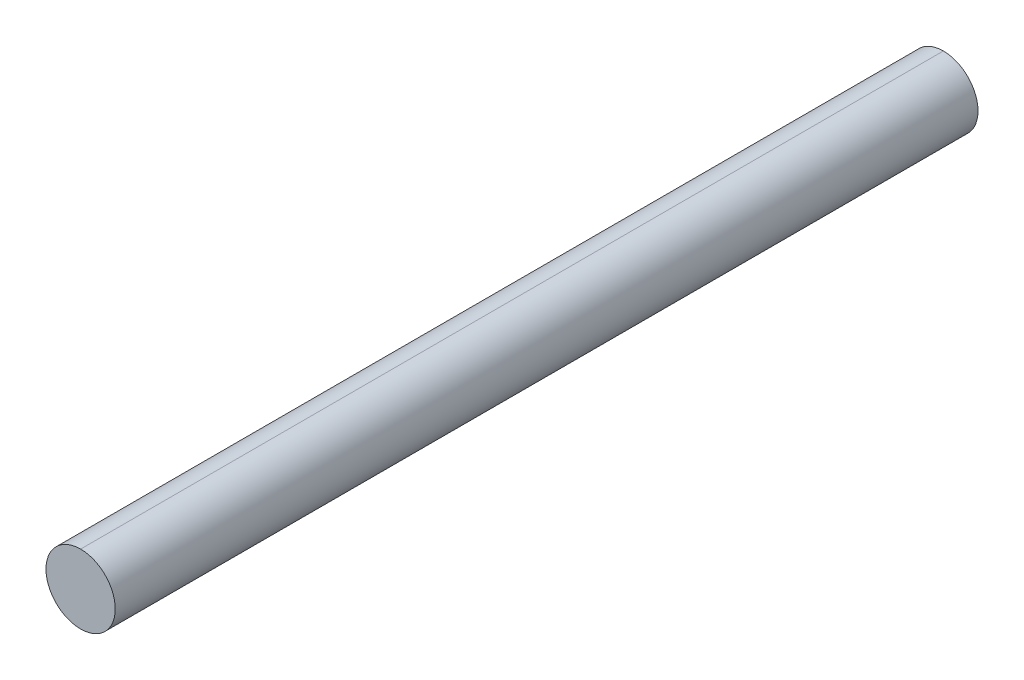
ISO-10303-21;
HEADER;
FILE_DESCRIPTION(('STEP AP214'),'2;1');
FILE_NAME('part.step','',(''),(''),'','','');
FILE_SCHEMA(('AUTOMOTIVE_DESIGN { 1 0 10303 214 1 1 1 1 }'));
ENDSEC;
DATA;
#1=APPLICATION_CONTEXT('core data for automotive mechanical design processes');
#2=APPLICATION_PROTOCOL_DEFINITION('international standard','automotive_design',2000,#1);
#3=PRODUCT_CONTEXT('',#1,'mechanical');
#4=PRODUCT('Part','Part','',(#3));
#5=PRODUCT_RELATED_PRODUCT_CATEGORY('part','',(#4));
#6=PRODUCT_DEFINITION_FORMATION('','',#4);
#7=PRODUCT_DEFINITION_CONTEXT('part definition',#1,'design');
#8=PRODUCT_DEFINITION('design','',#6,#7);
#9=PRODUCT_DEFINITION_SHAPE('','',#8);
#10=(LENGTH_UNIT() NAMED_UNIT(*) SI_UNIT(.MILLI.,.METRE.));
#11=(NAMED_UNIT(*) PLANE_ANGLE_UNIT() SI_UNIT($,.RADIAN.));
#12=(NAMED_UNIT(*) SI_UNIT($,.STERADIAN.) SOLID_ANGLE_UNIT());
#13=UNCERTAINTY_MEASURE_WITH_UNIT(LENGTH_MEASURE(1.E-05),#10,'distance_accuracy_value','');
#14=(GEOMETRIC_REPRESENTATION_CONTEXT(3) GLOBAL_UNCERTAINTY_ASSIGNED_CONTEXT((#13)) GLOBAL_UNIT_ASSIGNED_CONTEXT((#10,
#11,#12)) REPRESENTATION_CONTEXT('',''));
#15=CARTESIAN_POINT('',(0.,0.,0.));
#16=DIRECTION('',(0.,0.,1.));
#17=DIRECTION('',(1.,0.,0.));
#18=AXIS2_PLACEMENT_3D('',#15,#16,#17);
#19=CARTESIAN_POINT('',(0.,0.,304.));
#20=DIRECTION('',(0.,0.,-1.));
#21=DIRECTION('',(-1.,0.,0.));
#22=AXIS2_PLACEMENT_3D('',#19,#20,#21);
#23=CYLINDRICAL_SURFACE('',#22,12.2);
#24=DIRECTION('',(0.,0.,-1.));
#25=VECTOR('',#24,1.);
#26=CARTESIAN_POINT('',(0.,-12.2,304.));
#27=LINE('',#26,#25);
#28=CARTESIAN_POINT('',(0.,-12.2,304.));
#29=VERTEX_POINT('',#28);
#30=CARTESIAN_POINT('',(0.,-12.2,0.));
#31=VERTEX_POINT('',#30);
#32=EDGE_CURVE('E11',#29,#31,#27,.T.);
#33=ORIENTED_EDGE('',*,*,#32,.F.);
#34=CARTESIAN_POINT('',(0.,0.,304.));
#35=DIRECTION('',(0.,0.,1.));
#36=DIRECTION('',(1.,0.,0.));
#37=AXIS2_PLACEMENT_3D('',#34,#35,#36);
#38=CIRCLE('',#37,12.2);
#39=CARTESIAN_POINT('',(0.,12.2,304.));
#40=VERTEX_POINT('',#39);
#41=EDGE_CURVE('E73',#40,#29,#38,.T.);
#42=ORIENTED_EDGE('',*,*,#41,.F.);
#43=DIRECTION('',(0.,0.,-1.));
#44=VECTOR('',#43,1.);
#45=CARTESIAN_POINT('',(0.,12.2,304.));
#46=LINE('',#45,#44);
#47=CARTESIAN_POINT('',(0.,12.2,0.));
#48=VERTEX_POINT('',#47);
#49=EDGE_CURVE('E51',#48,#40,#46,.F.);
#50=ORIENTED_EDGE('',*,*,#49,.F.);
#51=CARTESIAN_POINT('',(0.,0.,0.));
#52=DIRECTION('',(0.,0.,1.));
#53=DIRECTION('',(1.,0.,0.));
#54=AXIS2_PLACEMENT_3D('',#51,#52,#53);
#55=CIRCLE('',#54,12.2);
#56=EDGE_CURVE('E76',#48,#31,#55,.T.);
#57=ORIENTED_EDGE('',*,*,#56,.T.);
#58=EDGE_LOOP('',(#33,#42,#50,#57));
#59=FACE_BOUND('',#58,.T.);
#60=ADVANCED_FACE('F42',(#59),#23,.T.);
#61=EDGE_CURVE('E68',#29,#40,#38,.T.);
#62=ORIENTED_EDGE('',*,*,#61,.F.);
#63=ORIENTED_EDGE('',*,*,#32,.T.);
#64=EDGE_CURVE('E70',#31,#48,#55,.T.);
#65=ORIENTED_EDGE('',*,*,#64,.T.);
#66=ORIENTED_EDGE('',*,*,#49,.T.);
#67=EDGE_LOOP('',(#62,#63,#65,#66));
#68=FACE_BOUND('',#67,.T.);
#69=ADVANCED_FACE('F44',(#68),#23,.T.);
#70=CARTESIAN_POINT('',(0.,0.,304.));
#71=DIRECTION('',(0.,0.,1.));
#72=DIRECTION('',(1.,0.,0.));
#73=AXIS2_PLACEMENT_3D('',#70,#71,#72);
#74=PLANE('',#73);
#75=ORIENTED_EDGE('',*,*,#41,.T.);
#76=ORIENTED_EDGE('',*,*,#61,.T.);
#77=EDGE_LOOP('',(#75,#76));
#78=FACE_BOUND('',#77,.T.);
#79=ADVANCED_FACE('F75',(#78),#74,.T.);
#80=CARTESIAN_POINT('',(0.,0.,0.));
#81=DIRECTION('',(0.,0.,1.));
#82=DIRECTION('',(1.,0.,0.));
#83=AXIS2_PLACEMENT_3D('',#80,#81,#82);
#84=PLANE('',#83);
#85=ORIENTED_EDGE('',*,*,#56,.F.);
#86=ORIENTED_EDGE('',*,*,#64,.F.);
#87=EDGE_LOOP('',(#85,#86));
#88=FACE_BOUND('',#87,.T.);
#89=ADVANCED_FACE('F80',(#88),#84,.F.);
#90=CLOSED_SHELL('',(#60,#69,#79,#89));
#91=MANIFOLD_SOLID_BREP('B2',#90);
#92=ADVANCED_BREP_SHAPE_REPRESENTATION('',(#18,#91),#14);
#93=SHAPE_DEFINITION_REPRESENTATION(#9,#92);
ENDSEC;
END-ISO-10303-21;
